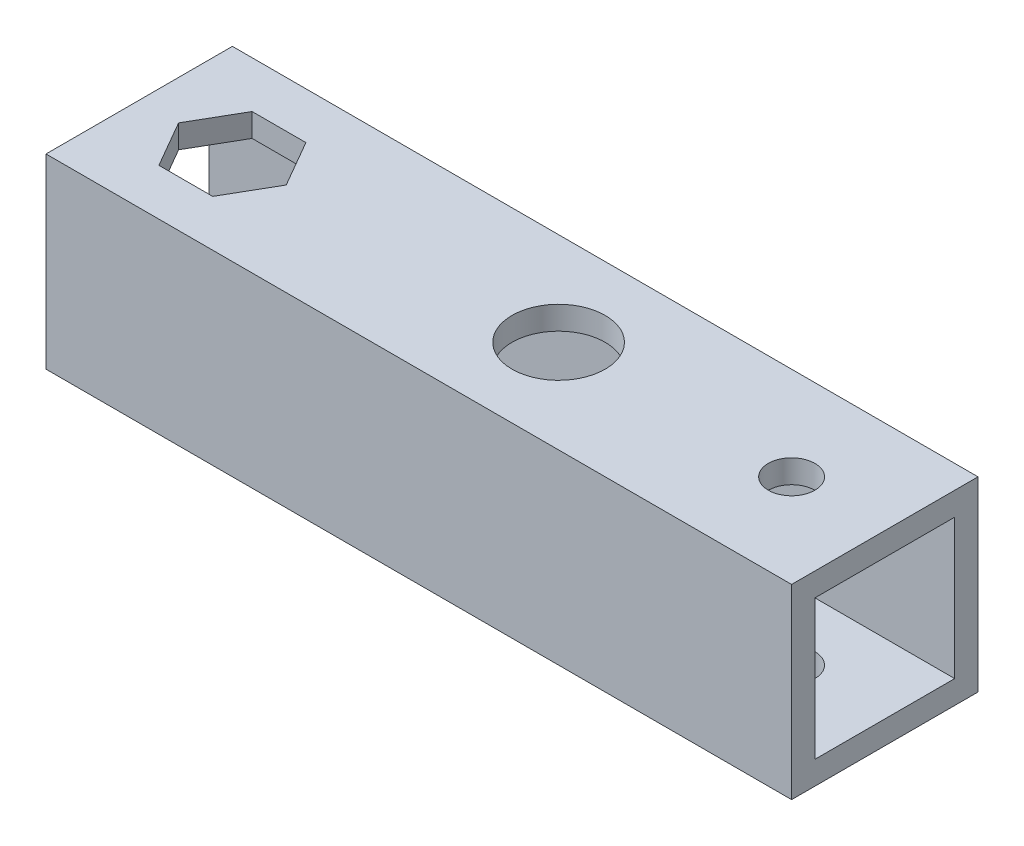
ISO-10303-21;
HEADER;
FILE_DESCRIPTION(('STEP AP214'),'2;1');
FILE_NAME('part.step','',(''),(''),'','','');
FILE_SCHEMA(('AUTOMOTIVE_DESIGN { 1 0 10303 214 1 1 1 1 }'));
ENDSEC;
DATA;
#1=APPLICATION_CONTEXT('core data for automotive mechanical design processes');
#2=APPLICATION_PROTOCOL_DEFINITION('international standard','automotive_design',2000,#1);
#3=PRODUCT_CONTEXT('',#1,'mechanical');
#4=PRODUCT('Part','Part','',(#3));
#5=PRODUCT_RELATED_PRODUCT_CATEGORY('part','',(#4));
#6=PRODUCT_DEFINITION_FORMATION('','',#4);
#7=PRODUCT_DEFINITION_CONTEXT('part definition',#1,'design');
#8=PRODUCT_DEFINITION('design','',#6,#7);
#9=PRODUCT_DEFINITION_SHAPE('','',#8);
#10=(LENGTH_UNIT() NAMED_UNIT(*) SI_UNIT(.MILLI.,.METRE.));
#11=(NAMED_UNIT(*) PLANE_ANGLE_UNIT() SI_UNIT($,.RADIAN.));
#12=(NAMED_UNIT(*) SI_UNIT($,.STERADIAN.) SOLID_ANGLE_UNIT());
#13=UNCERTAINTY_MEASURE_WITH_UNIT(LENGTH_MEASURE(1.E-05),#10,'distance_accuracy_value','');
#14=(GEOMETRIC_REPRESENTATION_CONTEXT(3) GLOBAL_UNCERTAINTY_ASSIGNED_CONTEXT((#13)) GLOBAL_UNIT_ASSIGNED_CONTEXT((#10,
#11,#12)) REPRESENTATION_CONTEXT('',''));
#15=CARTESIAN_POINT('',(0.,0.,0.));
#16=DIRECTION('',(0.,0.,1.));
#17=DIRECTION('',(1.,0.,0.));
#18=AXIS2_PLACEMENT_3D('',#15,#16,#17);
#19=CARTESIAN_POINT('',(44.45,25.4,0.));
#20=DIRECTION('',(0.,-1.,0.));
#21=DIRECTION('',(0.,0.,-1.));
#22=AXIS2_PLACEMENT_3D('',#19,#20,#21);
#23=CYLINDRICAL_SURFACE('',#22,6.35);
#24=CARTESIAN_POINT('',(44.45,22.225,0.));
#25=DIRECTION('',(0.,1.,0.));
#26=DIRECTION('',(0.,0.,1.));
#27=AXIS2_PLACEMENT_3D('',#24,#25,#26);
#28=CIRCLE('',#27,6.35);
#29=CARTESIAN_POINT('',(44.45,22.225,6.35));
#30=VERTEX_POINT('',#29);
#31=EDGE_CURVE('E234',#30,#30,#28,.T.);
#32=ORIENTED_EDGE('',*,*,#31,.F.);
#33=EDGE_LOOP('',(#32));
#34=FACE_BOUND('',#33,.T.);
#35=CARTESIAN_POINT('',(44.45,25.4,0.));
#36=DIRECTION('',(0.,1.,0.));
#37=DIRECTION('',(0.,0.,1.));
#38=AXIS2_PLACEMENT_3D('',#35,#36,#37);
#39=CIRCLE('',#38,6.35);
#40=CARTESIAN_POINT('',(44.45,25.4,6.35));
#41=VERTEX_POINT('',#40);
#42=EDGE_CURVE('E299',#41,#41,#39,.T.);
#43=ORIENTED_EDGE('',*,*,#42,.T.);
#44=EDGE_LOOP('',(#43));
#45=FACE_BOUND('',#44,.T.);
#46=ADVANCED_FACE('F33',(#34,#45),#23,.F.);
#47=CARTESIAN_POINT('',(76.2,25.4,0.));
#48=DIRECTION('',(0.,-1.,0.));
#49=DIRECTION('',(0.,0.,-1.));
#50=AXIS2_PLACEMENT_3D('',#47,#48,#49);
#51=CYLINDRICAL_SURFACE('',#50,3.175);
#52=CARTESIAN_POINT('',(76.2,22.225,0.));
#53=DIRECTION('',(0.,1.,0.));
#54=DIRECTION('',(0.,0.,1.));
#55=AXIS2_PLACEMENT_3D('',#52,#53,#54);
#56=CIRCLE('',#55,3.175);
#57=CARTESIAN_POINT('',(76.2,22.225,3.175));
#58=VERTEX_POINT('',#57);
#59=EDGE_CURVE('E231',#58,#58,#56,.T.);
#60=ORIENTED_EDGE('',*,*,#59,.F.);
#61=EDGE_LOOP('',(#60));
#62=FACE_BOUND('',#61,.T.);
#63=CARTESIAN_POINT('',(76.2,25.4,0.));
#64=DIRECTION('',(0.,1.,0.));
#65=DIRECTION('',(0.,0.,1.));
#66=AXIS2_PLACEMENT_3D('',#63,#64,#65);
#67=CIRCLE('',#66,3.175);
#68=CARTESIAN_POINT('',(76.2,25.4,3.175));
#69=VERTEX_POINT('',#68);
#70=EDGE_CURVE('E293',#69,#69,#67,.T.);
#71=ORIENTED_EDGE('',*,*,#70,.T.);
#72=EDGE_LOOP('',(#71));
#73=FACE_BOUND('',#72,.T.);
#74=ADVANCED_FACE('F379',(#62,#73),#51,.F.);
#75=CARTESIAN_POINT('',(3.66617420935413,25.4,6.35));
#76=DIRECTION('',(-0.866025403784439,0.,-0.5));
#77=DIRECTION('',(-0.5,0.,0.866025403784439));
#78=AXIS2_PLACEMENT_3D('',#75,#76,#77);
#79=PLANE('',#78);
#80=DIRECTION('',(0.5,0.,-0.866025403784439));
#81=VECTOR('',#80,1.);
#82=CARTESIAN_POINT('',(3.66617420935413,22.225,6.35));
#83=LINE('',#82,#81);
#84=CARTESIAN_POINT('',(3.66617420935413,22.225,6.35));
#85=VERTEX_POINT('',#84);
#86=CARTESIAN_POINT('',(7.33234841870825,22.225,0.));
#87=VERTEX_POINT('',#86);
#88=EDGE_CURVE('E229',#85,#87,#83,.T.);
#89=ORIENTED_EDGE('',*,*,#88,.F.);
#90=DIRECTION('',(0.,-1.,0.));
#91=VECTOR('',#90,1.);
#92=CARTESIAN_POINT('',(3.66617420935413,25.4,6.35));
#93=LINE('',#92,#91);
#94=CARTESIAN_POINT('',(3.66617420935413,25.4,6.35));
#95=VERTEX_POINT('',#94);
#96=EDGE_CURVE('E269',#95,#85,#93,.T.);
#97=ORIENTED_EDGE('',*,*,#96,.F.);
#98=DIRECTION('',(0.5,0.,-0.866025403784439));
#99=VECTOR('',#98,1.);
#100=CARTESIAN_POINT('',(3.66617420935413,25.4,6.35));
#101=LINE('',#100,#99);
#102=CARTESIAN_POINT('',(7.33234841870825,25.4,0.));
#103=VERTEX_POINT('',#102);
#104=EDGE_CURVE('E238',#95,#103,#101,.T.);
#105=ORIENTED_EDGE('',*,*,#104,.T.);
#106=DIRECTION('',(0.,-1.,0.));
#107=VECTOR('',#106,1.);
#108=CARTESIAN_POINT('',(7.33234841870825,25.4,0.));
#109=LINE('',#108,#107);
#110=EDGE_CURVE('E289',#103,#87,#109,.T.);
#111=ORIENTED_EDGE('',*,*,#110,.T.);
#112=EDGE_LOOP('',(#89,#97,#105,#111));
#113=FACE_BOUND('',#112,.T.);
#114=ADVANCED_FACE('F369',(#113),#79,.T.);
#115=CARTESIAN_POINT('',(7.33234841870825,25.4,0.));
#116=DIRECTION('',(-0.866025403784438,0.,0.5));
#117=DIRECTION('',(0.5,0.,0.866025403784439));
#118=AXIS2_PLACEMENT_3D('',#115,#116,#117);
#119=PLANE('',#118);
#120=DIRECTION('',(-0.5,0.,-0.866025403784439));
#121=VECTOR('',#120,1.);
#122=CARTESIAN_POINT('',(7.33234841870825,22.225,0.));
#123=LINE('',#122,#121);
#124=CARTESIAN_POINT('',(3.66617420935412,22.225,-6.35));
#125=VERTEX_POINT('',#124);
#126=EDGE_CURVE('E227',#87,#125,#123,.T.);
#127=ORIENTED_EDGE('',*,*,#126,.F.);
#128=ORIENTED_EDGE('',*,*,#110,.F.);
#129=DIRECTION('',(-0.5,0.,-0.866025403784438));
#130=VECTOR('',#129,1.);
#131=CARTESIAN_POINT('',(7.33234841870825,25.4,0.));
#132=LINE('',#131,#130);
#133=CARTESIAN_POINT('',(3.66617420935412,25.4,-6.35));
#134=VERTEX_POINT('',#133);
#135=EDGE_CURVE('E240',#103,#134,#132,.T.);
#136=ORIENTED_EDGE('',*,*,#135,.T.);
#137=DIRECTION('',(0.,-1.,0.));
#138=VECTOR('',#137,1.);
#139=CARTESIAN_POINT('',(3.66617420935412,25.4,-6.35));
#140=LINE('',#139,#138);
#141=EDGE_CURVE('E285',#134,#125,#140,.T.);
#142=ORIENTED_EDGE('',*,*,#141,.T.);
#143=EDGE_LOOP('',(#127,#128,#136,#142));
#144=FACE_BOUND('',#143,.T.);
#145=ADVANCED_FACE('F375',(#144),#119,.T.);
#146=CARTESIAN_POINT('',(3.66617420935412,25.4,-6.35));
#147=DIRECTION('',(0.,0.,1.));
#148=DIRECTION('',(1.,0.,0.));
#149=AXIS2_PLACEMENT_3D('',#146,#147,#148);
#150=PLANE('',#149);
#151=DIRECTION('',(-1.,0.,0.));
#152=VECTOR('',#151,1.);
#153=CARTESIAN_POINT('',(3.66617420935412,22.225,-6.35));
#154=LINE('',#153,#152);
#155=CARTESIAN_POINT('',(-3.66617420935412,22.225,-6.35));
#156=VERTEX_POINT('',#155);
#157=EDGE_CURVE('E225',#125,#156,#154,.T.);
#158=ORIENTED_EDGE('',*,*,#157,.F.);
#159=ORIENTED_EDGE('',*,*,#141,.F.);
#160=DIRECTION('',(-1.,0.,0.));
#161=VECTOR('',#160,1.);
#162=CARTESIAN_POINT('',(3.66617420935412,25.4,-6.35));
#163=LINE('',#162,#161);
#164=CARTESIAN_POINT('',(-3.66617420935412,25.4,-6.35));
#165=VERTEX_POINT('',#164);
#166=EDGE_CURVE('E243',#134,#165,#163,.T.);
#167=ORIENTED_EDGE('',*,*,#166,.T.);
#168=DIRECTION('',(0.,-1.,0.));
#169=VECTOR('',#168,1.);
#170=CARTESIAN_POINT('',(-3.66617420935412,25.4,-6.35));
#171=LINE('',#170,#169);
#172=EDGE_CURVE('E281',#165,#156,#171,.T.);
#173=ORIENTED_EDGE('',*,*,#172,.T.);
#174=EDGE_LOOP('',(#158,#159,#167,#173));
#175=FACE_BOUND('',#174,.T.);
#176=ADVANCED_FACE('F455',(#175),#150,.T.);
#177=CARTESIAN_POINT('',(-3.66617420935412,25.4,-6.35));
#178=DIRECTION('',(0.866025403784439,0.,0.5));
#179=DIRECTION('',(0.5,0.,-0.866025403784439));
#180=AXIS2_PLACEMENT_3D('',#177,#178,#179);
#181=PLANE('',#180);
#182=DIRECTION('',(-0.5,0.,0.866025403784439));
#183=VECTOR('',#182,1.);
#184=CARTESIAN_POINT('',(-3.66617420935412,22.225,-6.35));
#185=LINE('',#184,#183);
#186=CARTESIAN_POINT('',(-7.33234841870825,22.225,0.));
#187=VERTEX_POINT('',#186);
#188=EDGE_CURVE('E223',#156,#187,#185,.T.);
#189=ORIENTED_EDGE('',*,*,#188,.F.);
#190=ORIENTED_EDGE('',*,*,#172,.F.);
#191=DIRECTION('',(-0.5,0.,0.866025403784439));
#192=VECTOR('',#191,1.);
#193=CARTESIAN_POINT('',(-3.66617420935412,25.4,-6.35));
#194=LINE('',#193,#192);
#195=CARTESIAN_POINT('',(-7.33234841870825,25.4,0.));
#196=VERTEX_POINT('',#195);
#197=EDGE_CURVE('E245',#165,#196,#194,.T.);
#198=ORIENTED_EDGE('',*,*,#197,.T.);
#199=DIRECTION('',(0.,-1.,0.));
#200=VECTOR('',#199,1.);
#201=CARTESIAN_POINT('',(-7.33234841870825,25.4,0.));
#202=LINE('',#201,#200);
#203=EDGE_CURVE('E277',#196,#187,#202,.T.);
#204=ORIENTED_EDGE('',*,*,#203,.T.);
#205=EDGE_LOOP('',(#189,#190,#198,#204));
#206=FACE_BOUND('',#205,.T.);
#207=ADVANCED_FACE('F459',(#206),#181,.T.);
#208=CARTESIAN_POINT('',(-7.33234841870825,25.4,0.));
#209=DIRECTION('',(0.866025403784438,0.,-0.5));
#210=DIRECTION('',(-0.5,0.,-0.866025403784439));
#211=AXIS2_PLACEMENT_3D('',#208,#209,#210);
#212=PLANE('',#211);
#213=DIRECTION('',(0.5,0.,0.866025403784439));
#214=VECTOR('',#213,1.);
#215=CARTESIAN_POINT('',(-7.33234841870825,22.225,0.));
#216=LINE('',#215,#214);
#217=CARTESIAN_POINT('',(-3.66617420935412,22.225,6.35));
#218=VERTEX_POINT('',#217);
#219=EDGE_CURVE('E221',#187,#218,#216,.T.);
#220=ORIENTED_EDGE('',*,*,#219,.F.);
#221=ORIENTED_EDGE('',*,*,#203,.F.);
#222=DIRECTION('',(0.5,0.,0.866025403784438));
#223=VECTOR('',#222,1.);
#224=CARTESIAN_POINT('',(-7.33234841870825,25.4,0.));
#225=LINE('',#224,#223);
#226=CARTESIAN_POINT('',(-3.66617420935412,25.4,6.35));
#227=VERTEX_POINT('',#226);
#228=EDGE_CURVE('E247',#196,#227,#225,.T.);
#229=ORIENTED_EDGE('',*,*,#228,.T.);
#230=DIRECTION('',(0.,-1.,0.));
#231=VECTOR('',#230,1.);
#232=CARTESIAN_POINT('',(-3.66617420935412,25.4,6.35));
#233=LINE('',#232,#231);
#234=EDGE_CURVE('E273',#227,#218,#233,.T.);
#235=ORIENTED_EDGE('',*,*,#234,.T.);
#236=EDGE_LOOP('',(#220,#221,#229,#235));
#237=FACE_BOUND('',#236,.T.);
#238=ADVANCED_FACE('F463',(#237),#212,.T.);
#239=CARTESIAN_POINT('',(-3.66617420935412,25.4,6.35));
#240=DIRECTION('',(0.,0.,-1.));
#241=DIRECTION('',(-1.,0.,0.));
#242=AXIS2_PLACEMENT_3D('',#239,#240,#241);
#243=PLANE('',#242);
#244=DIRECTION('',(1.,0.,0.));
#245=VECTOR('',#244,1.);
#246=CARTESIAN_POINT('',(-3.66617420935412,22.225,6.35));
#247=LINE('',#246,#245);
#248=EDGE_CURVE('E11',#218,#85,#247,.T.);
#249=ORIENTED_EDGE('',*,*,#248,.F.);
#250=ORIENTED_EDGE('',*,*,#234,.F.);
#251=DIRECTION('',(1.,0.,0.));
#252=VECTOR('',#251,1.);
#253=CARTESIAN_POINT('',(-3.66617420935412,25.4,6.35));
#254=LINE('',#253,#252);
#255=EDGE_CURVE('E250',#227,#95,#254,.T.);
#256=ORIENTED_EDGE('',*,*,#255,.T.);
#257=ORIENTED_EDGE('',*,*,#96,.T.);
#258=EDGE_LOOP('',(#249,#250,#256,#257));
#259=FACE_BOUND('',#258,.T.);
#260=ADVANCED_FACE('F414',(#259),#243,.T.);
#261=CARTESIAN_POINT('',(0.,25.4,0.));
#262=DIRECTION('',(0.,-1.,0.));
#263=DIRECTION('',(0.,0.,-1.));
#264=AXIS2_PLACEMENT_3D('',#261,#262,#263);
#265=PLANE('',#264);
#266=ORIENTED_EDGE('',*,*,#70,.F.);
#267=EDGE_LOOP('',(#266));
#268=FACE_BOUND('',#267,.T.);
#269=DIRECTION('',(0.,0.,-1.));
#270=VECTOR('',#269,1.);
#271=CARTESIAN_POINT('',(88.8999999999999,25.4,-12.7));
#272=LINE('',#271,#270);
#273=CARTESIAN_POINT('',(88.8999999999999,25.4,12.7));
#274=VERTEX_POINT('',#273);
#275=CARTESIAN_POINT('',(88.8999999999999,25.4,-12.7));
#276=VERTEX_POINT('',#275);
#277=EDGE_CURVE('E305',#274,#276,#272,.T.);
#278=ORIENTED_EDGE('',*,*,#277,.T.);
#279=DIRECTION('',(-1.,0.,0.));
#280=VECTOR('',#279,1.);
#281=CARTESIAN_POINT('',(88.8999999999999,25.4,-12.7));
#282=LINE('',#281,#280);
#283=CARTESIAN_POINT('',(-12.7,25.4,-12.7));
#284=VERTEX_POINT('',#283);
#285=EDGE_CURVE('E308',#276,#284,#282,.T.);
#286=ORIENTED_EDGE('',*,*,#285,.T.);
#287=DIRECTION('',(0.,0.,1.));
#288=VECTOR('',#287,1.);
#289=CARTESIAN_POINT('',(-12.7,25.4,-12.7));
#290=LINE('',#289,#288);
#291=CARTESIAN_POINT('',(-12.7,25.4,12.7));
#292=VERTEX_POINT('',#291);
#293=EDGE_CURVE('E311',#284,#292,#290,.T.);
#294=ORIENTED_EDGE('',*,*,#293,.T.);
#295=DIRECTION('',(1.,0.,0.));
#296=VECTOR('',#295,1.);
#297=CARTESIAN_POINT('',(88.8999999999999,25.4,12.7));
#298=LINE('',#297,#296);
#299=EDGE_CURVE('E313',#292,#274,#298,.T.);
#300=ORIENTED_EDGE('',*,*,#299,.T.);
#301=EDGE_LOOP('',(#278,#286,#294,#300));
#302=FACE_BOUND('',#301,.T.);
#303=ORIENTED_EDGE('',*,*,#42,.F.);
#304=EDGE_LOOP('',(#303));
#305=FACE_BOUND('',#304,.T.);
#306=ORIENTED_EDGE('',*,*,#104,.F.);
#307=ORIENTED_EDGE('',*,*,#255,.F.);
#308=ORIENTED_EDGE('',*,*,#228,.F.);
#309=ORIENTED_EDGE('',*,*,#197,.F.);
#310=ORIENTED_EDGE('',*,*,#166,.F.);
#311=ORIENTED_EDGE('',*,*,#135,.F.);
#312=EDGE_LOOP('',(#306,#307,#308,#309,#310,#311));
#313=FACE_BOUND('',#312,.T.);
#314=ADVANCED_FACE('F405',(#268,#302,#305,#313),#265,.F.);
#315=CARTESIAN_POINT('',(0.,0.,0.));
#316=DIRECTION('',(0.,-1.,0.));
#317=DIRECTION('',(0.,0.,-1.));
#318=AXIS2_PLACEMENT_3D('',#315,#316,#317);
#319=PLANE('',#318);
#320=CARTESIAN_POINT('',(76.2,0.,0.));
#321=DIRECTION('',(0.,1.,0.));
#322=DIRECTION('',(0.,0.,1.));
#323=AXIS2_PLACEMENT_3D('',#320,#321,#322);
#324=CIRCLE('',#323,3.175);
#325=CARTESIAN_POINT('',(76.2,0.,3.175));
#326=VERTEX_POINT('',#325);
#327=EDGE_CURVE('E292',#326,#326,#324,.T.);
#328=ORIENTED_EDGE('',*,*,#327,.T.);
#329=EDGE_LOOP('',(#328));
#330=FACE_BOUND('',#329,.T.);
#331=DIRECTION('',(0.,0.,-1.));
#332=VECTOR('',#331,1.);
#333=CARTESIAN_POINT('',(88.8999999999999,0.,-12.7));
#334=LINE('',#333,#332);
#335=CARTESIAN_POINT('',(88.8999999999999,0.,12.7));
#336=VERTEX_POINT('',#335);
#337=CARTESIAN_POINT('',(88.8999999999999,0.,-12.7));
#338=VERTEX_POINT('',#337);
#339=EDGE_CURVE('E302',#336,#338,#334,.T.);
#340=ORIENTED_EDGE('',*,*,#339,.F.);
#341=DIRECTION('',(1.,0.,0.));
#342=VECTOR('',#341,1.);
#343=CARTESIAN_POINT('',(88.8999999999999,0.,12.7));
#344=LINE('',#343,#342);
#345=CARTESIAN_POINT('',(-12.7,0.,12.7));
#346=VERTEX_POINT('',#345);
#347=EDGE_CURVE('E309',#346,#336,#344,.T.);
#348=ORIENTED_EDGE('',*,*,#347,.F.);
#349=DIRECTION('',(0.,0.,1.));
#350=VECTOR('',#349,1.);
#351=CARTESIAN_POINT('',(-12.7,0.,-12.7));
#352=LINE('',#351,#350);
#353=CARTESIAN_POINT('',(-12.7,0.,-12.7));
#354=VERTEX_POINT('',#353);
#355=EDGE_CURVE('E320',#354,#346,#352,.T.);
#356=ORIENTED_EDGE('',*,*,#355,.F.);
#357=DIRECTION('',(-1.,0.,0.));
#358=VECTOR('',#357,1.);
#359=CARTESIAN_POINT('',(88.8999999999999,0.,-12.7));
#360=LINE('',#359,#358);
#361=EDGE_CURVE('E318',#338,#354,#360,.T.);
#362=ORIENTED_EDGE('',*,*,#361,.F.);
#363=EDGE_LOOP('',(#340,#348,#356,#362));
#364=FACE_BOUND('',#363,.T.);
#365=CARTESIAN_POINT('',(44.45,0.,0.));
#366=DIRECTION('',(0.,1.,0.));
#367=DIRECTION('',(0.,0.,1.));
#368=AXIS2_PLACEMENT_3D('',#365,#366,#367);
#369=CIRCLE('',#368,6.35);
#370=CARTESIAN_POINT('',(44.45,0.,6.35));
#371=VERTEX_POINT('',#370);
#372=EDGE_CURVE('E296',#371,#371,#369,.T.);
#373=ORIENTED_EDGE('',*,*,#372,.T.);
#374=EDGE_LOOP('',(#373));
#375=FACE_BOUND('',#374,.T.);
#376=DIRECTION('',(1.,0.,0.));
#377=VECTOR('',#376,1.);
#378=CARTESIAN_POINT('',(-3.66617420935412,0.,6.35));
#379=LINE('',#378,#377);
#380=CARTESIAN_POINT('',(-3.66617420935412,0.,6.35));
#381=VERTEX_POINT('',#380);
#382=CARTESIAN_POINT('',(3.66617420935413,0.,6.35));
#383=VERTEX_POINT('',#382);
#384=EDGE_CURVE('E241',#381,#383,#379,.T.);
#385=ORIENTED_EDGE('',*,*,#384,.T.);
#386=DIRECTION('',(0.5,0.,-0.866025403784439));
#387=VECTOR('',#386,1.);
#388=CARTESIAN_POINT('',(3.66617420935413,0.,6.35));
#389=LINE('',#388,#387);
#390=CARTESIAN_POINT('',(7.33234841870825,0.,0.));
#391=VERTEX_POINT('',#390);
#392=EDGE_CURVE('E237',#383,#391,#389,.T.);
#393=ORIENTED_EDGE('',*,*,#392,.T.);
#394=DIRECTION('',(-0.5,0.,-0.866025403784438));
#395=VECTOR('',#394,1.);
#396=CARTESIAN_POINT('',(7.33234841870825,0.,0.));
#397=LINE('',#396,#395);
#398=CARTESIAN_POINT('',(3.66617420935412,0.,-6.35));
#399=VERTEX_POINT('',#398);
#400=EDGE_CURVE('E255',#391,#399,#397,.T.);
#401=ORIENTED_EDGE('',*,*,#400,.T.);
#402=DIRECTION('',(-1.,0.,0.));
#403=VECTOR('',#402,1.);
#404=CARTESIAN_POINT('',(3.66617420935412,0.,-6.35));
#405=LINE('',#404,#403);
#406=CARTESIAN_POINT('',(-3.66617420935412,0.,-6.35));
#407=VERTEX_POINT('',#406);
#408=EDGE_CURVE('E258',#399,#407,#405,.T.);
#409=ORIENTED_EDGE('',*,*,#408,.T.);
#410=DIRECTION('',(-0.5,0.,0.866025403784439));
#411=VECTOR('',#410,1.);
#412=CARTESIAN_POINT('',(-3.66617420935412,0.,-6.35));
#413=LINE('',#412,#411);
#414=CARTESIAN_POINT('',(-7.33234841870825,0.,0.));
#415=VERTEX_POINT('',#414);
#416=EDGE_CURVE('E261',#407,#415,#413,.T.);
#417=ORIENTED_EDGE('',*,*,#416,.T.);
#418=DIRECTION('',(0.5,0.,0.866025403784438));
#419=VECTOR('',#418,1.);
#420=CARTESIAN_POINT('',(-7.33234841870825,0.,0.));
#421=LINE('',#420,#419);
#422=EDGE_CURVE('E264',#415,#381,#421,.T.);
#423=ORIENTED_EDGE('',*,*,#422,.T.);
#424=EDGE_LOOP('',(#385,#393,#401,#409,#417,#423));
#425=FACE_BOUND('',#424,.T.);
#426=ADVANCED_FACE('F349',(#330,#364,#375,#425),#319,.T.);
#427=CARTESIAN_POINT('',(88.8999999999999,25.4,-12.7));
#428=DIRECTION('',(-1.,0.,0.));
#429=DIRECTION('',(0.,0.,1.));
#430=AXIS2_PLACEMENT_3D('',#427,#428,#429);
#431=PLANE('',#430);
#432=DIRECTION('',(0.,0.,-1.));
#433=VECTOR('',#432,1.);
#434=CARTESIAN_POINT('',(88.8999999999999,3.175,9.52499999999999));
#435=LINE('',#434,#433);
#436=CARTESIAN_POINT('',(88.8999999999999,3.175,9.52499999999999));
#437=VERTEX_POINT('',#436);
#438=CARTESIAN_POINT('',(88.8999999999999,3.175,-9.52500000000001));
#439=VERTEX_POINT('',#438);
#440=EDGE_CURVE('E196',#437,#439,#435,.T.);
#441=ORIENTED_EDGE('',*,*,#440,.F.);
#442=DIRECTION('',(0.,-1.,0.));
#443=VECTOR('',#442,1.);
#444=CARTESIAN_POINT('',(88.8999999999999,22.225,9.52499999999999));
#445=LINE('',#444,#443);
#446=CARTESIAN_POINT('',(88.8999999999999,22.225,9.52499999999999));
#447=VERTEX_POINT('',#446);
#448=EDGE_CURVE('E48',#447,#437,#445,.T.);
#449=ORIENTED_EDGE('',*,*,#448,.F.);
#450=DIRECTION('',(0.,0.,1.));
#451=VECTOR('',#450,1.);
#452=CARTESIAN_POINT('',(88.8999999999999,22.225,-9.52500000000001));
#453=LINE('',#452,#451);
#454=CARTESIAN_POINT('',(88.8999999999999,22.225,-9.52500000000001));
#455=VERTEX_POINT('',#454);
#456=EDGE_CURVE('E187',#455,#447,#453,.T.);
#457=ORIENTED_EDGE('',*,*,#456,.F.);
#458=DIRECTION('',(0.,1.,0.));
#459=VECTOR('',#458,1.);
#460=CARTESIAN_POINT('',(88.8999999999999,3.175,-9.52500000000001));
#461=LINE('',#460,#459);
#462=EDGE_CURVE('E190',#439,#455,#461,.T.);
#463=ORIENTED_EDGE('',*,*,#462,.F.);
#464=EDGE_LOOP('',(#441,#449,#457,#463));
#465=FACE_BOUND('',#464,.T.);
#466=ORIENTED_EDGE('',*,*,#339,.T.);
#467=DIRECTION('',(0.,-1.,0.));
#468=VECTOR('',#467,1.);
#469=CARTESIAN_POINT('',(88.8999999999999,25.4,-12.7));
#470=LINE('',#469,#468);
#471=EDGE_CURVE('E331',#276,#338,#470,.T.);
#472=ORIENTED_EDGE('',*,*,#471,.F.);
#473=ORIENTED_EDGE('',*,*,#277,.F.);
#474=DIRECTION('',(0.,-1.,0.));
#475=VECTOR('',#474,1.);
#476=CARTESIAN_POINT('',(88.8999999999999,25.4,12.7));
#477=LINE('',#476,#475);
#478=EDGE_CURVE('E315',#274,#336,#477,.T.);
#479=ORIENTED_EDGE('',*,*,#478,.T.);
#480=EDGE_LOOP('',(#466,#472,#473,#479));
#481=FACE_BOUND('',#480,.T.);
#482=ADVANCED_FACE('F35',(#465,#481),#431,.F.);
#483=CARTESIAN_POINT('',(88.8999999999999,25.4,-12.7));
#484=DIRECTION('',(0.,0.,1.));
#485=DIRECTION('',(1.,0.,0.));
#486=AXIS2_PLACEMENT_3D('',#483,#484,#485);
#487=PLANE('',#486);
#488=ORIENTED_EDGE('',*,*,#361,.T.);
#489=DIRECTION('',(0.,-1.,0.));
#490=VECTOR('',#489,1.);
#491=CARTESIAN_POINT('',(-12.7,25.4,-12.7));
#492=LINE('',#491,#490);
#493=EDGE_CURVE('E328',#284,#354,#492,.T.);
#494=ORIENTED_EDGE('',*,*,#493,.F.);
#495=ORIENTED_EDGE('',*,*,#285,.F.);
#496=ORIENTED_EDGE('',*,*,#471,.T.);
#497=EDGE_LOOP('',(#488,#494,#495,#496));
#498=FACE_BOUND('',#497,.T.);
#499=ADVANCED_FACE('F412',(#498),#487,.F.);
#500=CARTESIAN_POINT('',(-12.7,25.4,-12.7));
#501=DIRECTION('',(1.,0.,0.));
#502=DIRECTION('',(0.,0.,-1.));
#503=AXIS2_PLACEMENT_3D('',#500,#501,#502);
#504=PLANE('',#503);
#505=DIRECTION('',(0.,0.,1.));
#506=VECTOR('',#505,1.);
#507=CARTESIAN_POINT('',(-12.7,22.225,-9.52500000000001));
#508=LINE('',#507,#506);
#509=CARTESIAN_POINT('',(-12.7,22.225,-9.52500000000001));
#510=VERTEX_POINT('',#509);
#511=CARTESIAN_POINT('',(-12.7,22.225,9.52499999999999));
#512=VERTEX_POINT('',#511);
#513=EDGE_CURVE('E177',#510,#512,#508,.T.);
#514=ORIENTED_EDGE('',*,*,#513,.T.);
#515=DIRECTION('',(0.,-1.,0.));
#516=VECTOR('',#515,1.);
#517=CARTESIAN_POINT('',(-12.7,22.225,9.52499999999999));
#518=LINE('',#517,#516);
#519=CARTESIAN_POINT('',(-12.7,3.175,9.52499999999999));
#520=VERTEX_POINT('',#519);
#521=EDGE_CURVE('E171',#512,#520,#518,.T.);
#522=ORIENTED_EDGE('',*,*,#521,.T.);
#523=DIRECTION('',(0.,0.,-1.));
#524=VECTOR('',#523,1.);
#525=CARTESIAN_POINT('',(-12.7,3.175,9.52499999999999));
#526=LINE('',#525,#524);
#527=CARTESIAN_POINT('',(-12.7,3.175,-9.52500000000001));
#528=VERTEX_POINT('',#527);
#529=EDGE_CURVE('E180',#520,#528,#526,.T.);
#530=ORIENTED_EDGE('',*,*,#529,.T.);
#531=DIRECTION('',(0.,1.,0.));
#532=VECTOR('',#531,1.);
#533=CARTESIAN_POINT('',(-12.7,3.175,-9.52500000000001));
#534=LINE('',#533,#532);
#535=EDGE_CURVE('E56',#528,#510,#534,.T.);
#536=ORIENTED_EDGE('',*,*,#535,.T.);
#537=EDGE_LOOP('',(#514,#522,#530,#536));
#538=FACE_BOUND('',#537,.T.);
#539=ORIENTED_EDGE('',*,*,#355,.T.);
#540=DIRECTION('',(0.,-1.,0.));
#541=VECTOR('',#540,1.);
#542=CARTESIAN_POINT('',(-12.7,25.4,12.7));
#543=LINE('',#542,#541);
#544=EDGE_CURVE('E325',#292,#346,#543,.T.);
#545=ORIENTED_EDGE('',*,*,#544,.F.);
#546=ORIENTED_EDGE('',*,*,#293,.F.);
#547=ORIENTED_EDGE('',*,*,#493,.T.);
#548=EDGE_LOOP('',(#539,#545,#546,#547));
#549=FACE_BOUND('',#548,.T.);
#550=ADVANCED_FACE('F184',(#538,#549),#504,.F.);
#551=CARTESIAN_POINT('',(88.8999999999999,25.4,12.7));
#552=DIRECTION('',(0.,0.,-1.));
#553=DIRECTION('',(-1.,0.,0.));
#554=AXIS2_PLACEMENT_3D('',#551,#552,#553);
#555=PLANE('',#554);
#556=ORIENTED_EDGE('',*,*,#347,.T.);
#557=ORIENTED_EDGE('',*,*,#478,.F.);
#558=ORIENTED_EDGE('',*,*,#299,.F.);
#559=ORIENTED_EDGE('',*,*,#544,.T.);
#560=EDGE_LOOP('',(#556,#557,#558,#559));
#561=FACE_BOUND('',#560,.T.);
#562=ADVANCED_FACE('F393',(#561),#555,.F.);
#563=CARTESIAN_POINT('',(44.45,3.175,0.));
#564=DIRECTION('',(0.,-1.,0.));
#565=DIRECTION('',(0.,0.,-1.));
#566=AXIS2_PLACEMENT_3D('',#563,#564,#565);
#567=CIRCLE('',#566,6.35);
#568=CARTESIAN_POINT('',(44.45,3.175,-6.35));
#569=VERTEX_POINT('',#568);
#570=EDGE_CURVE('E218',#569,#569,#567,.T.);
#571=ORIENTED_EDGE('',*,*,#570,.F.);
#572=EDGE_LOOP('',(#571));
#573=FACE_BOUND('',#572,.T.);
#574=ORIENTED_EDGE('',*,*,#372,.F.);
#575=EDGE_LOOP('',(#574));
#576=FACE_BOUND('',#575,.T.);
#577=ADVANCED_FACE('F376',(#573,#576),#23,.F.);
#578=CARTESIAN_POINT('',(76.2,3.175,0.));
#579=DIRECTION('',(0.,-1.,0.));
#580=DIRECTION('',(0.,0.,-1.));
#581=AXIS2_PLACEMENT_3D('',#578,#579,#580);
#582=CIRCLE('',#581,3.175);
#583=CARTESIAN_POINT('',(76.2,3.175,-3.175));
#584=VERTEX_POINT('',#583);
#585=EDGE_CURVE('E215',#584,#584,#582,.T.);
#586=ORIENTED_EDGE('',*,*,#585,.F.);
#587=EDGE_LOOP('',(#586));
#588=FACE_BOUND('',#587,.T.);
#589=ORIENTED_EDGE('',*,*,#327,.F.);
#590=EDGE_LOOP('',(#589));
#591=FACE_BOUND('',#590,.T.);
#592=ADVANCED_FACE('F367',(#588,#591),#51,.F.);
#593=DIRECTION('',(-0.5,0.,0.866025403784439));
#594=VECTOR('',#593,1.);
#595=CARTESIAN_POINT('',(3.66617420935413,3.175,6.35));
#596=LINE('',#595,#594);
#597=CARTESIAN_POINT('',(7.33234841870825,3.175,0.));
#598=VERTEX_POINT('',#597);
#599=CARTESIAN_POINT('',(3.66617420935413,3.175,6.35));
#600=VERTEX_POINT('',#599);
#601=EDGE_CURVE('E213',#598,#600,#596,.T.);
#602=ORIENTED_EDGE('',*,*,#601,.F.);
#603=EDGE_CURVE('E288',#598,#391,#109,.T.);
#604=ORIENTED_EDGE('',*,*,#603,.T.);
#605=ORIENTED_EDGE('',*,*,#392,.F.);
#606=EDGE_CURVE('E252',#600,#383,#93,.T.);
#607=ORIENTED_EDGE('',*,*,#606,.F.);
#608=EDGE_LOOP('',(#602,#604,#605,#607));
#609=FACE_BOUND('',#608,.T.);
#610=ADVANCED_FACE('F365',(#609),#79,.T.);
#611=DIRECTION('',(0.5,0.,0.866025403784439));
#612=VECTOR('',#611,1.);
#613=CARTESIAN_POINT('',(7.33234841870825,3.175,0.));
#614=LINE('',#613,#612);
#615=CARTESIAN_POINT('',(3.66617420935412,3.175,-6.35));
#616=VERTEX_POINT('',#615);
#617=EDGE_CURVE('E211',#616,#598,#614,.T.);
#618=ORIENTED_EDGE('',*,*,#617,.F.);
#619=EDGE_CURVE('E284',#616,#399,#140,.T.);
#620=ORIENTED_EDGE('',*,*,#619,.T.);
#621=ORIENTED_EDGE('',*,*,#400,.F.);
#622=ORIENTED_EDGE('',*,*,#603,.F.);
#623=EDGE_LOOP('',(#618,#620,#621,#622));
#624=FACE_BOUND('',#623,.T.);
#625=ADVANCED_FACE('F362',(#624),#119,.T.);
#626=DIRECTION('',(1.,0.,0.));
#627=VECTOR('',#626,1.);
#628=CARTESIAN_POINT('',(3.66617420935412,3.175,-6.35));
#629=LINE('',#628,#627);
#630=CARTESIAN_POINT('',(-3.66617420935412,3.175,-6.35));
#631=VERTEX_POINT('',#630);
#632=EDGE_CURVE('E209',#631,#616,#629,.T.);
#633=ORIENTED_EDGE('',*,*,#632,.F.);
#634=EDGE_CURVE('E280',#631,#407,#171,.T.);
#635=ORIENTED_EDGE('',*,*,#634,.T.);
#636=ORIENTED_EDGE('',*,*,#408,.F.);
#637=ORIENTED_EDGE('',*,*,#619,.F.);
#638=EDGE_LOOP('',(#633,#635,#636,#637));
#639=FACE_BOUND('',#638,.T.);
#640=ADVANCED_FACE('F359',(#639),#150,.T.);
#641=DIRECTION('',(0.5,0.,-0.866025403784439));
#642=VECTOR('',#641,1.);
#643=CARTESIAN_POINT('',(-3.66617420935412,3.175,-6.35));
#644=LINE('',#643,#642);
#645=CARTESIAN_POINT('',(-7.33234841870825,3.175,0.));
#646=VERTEX_POINT('',#645);
#647=EDGE_CURVE('E207',#646,#631,#644,.T.);
#648=ORIENTED_EDGE('',*,*,#647,.F.);
#649=EDGE_CURVE('E276',#646,#415,#202,.T.);
#650=ORIENTED_EDGE('',*,*,#649,.T.);
#651=ORIENTED_EDGE('',*,*,#416,.F.);
#652=ORIENTED_EDGE('',*,*,#634,.F.);
#653=EDGE_LOOP('',(#648,#650,#651,#652));
#654=FACE_BOUND('',#653,.T.);
#655=ADVANCED_FACE('F354',(#654),#181,.T.);
#656=DIRECTION('',(-0.5,0.,-0.866025403784439));
#657=VECTOR('',#656,1.);
#658=CARTESIAN_POINT('',(-7.33234841870825,3.175,0.));
#659=LINE('',#658,#657);
#660=CARTESIAN_POINT('',(-3.66617420935412,3.175,6.35));
#661=VERTEX_POINT('',#660);
#662=EDGE_CURVE('E202',#661,#646,#659,.T.);
#663=ORIENTED_EDGE('',*,*,#662,.F.);
#664=EDGE_CURVE('E272',#661,#381,#233,.T.);
#665=ORIENTED_EDGE('',*,*,#664,.T.);
#666=ORIENTED_EDGE('',*,*,#422,.F.);
#667=ORIENTED_EDGE('',*,*,#649,.F.);
#668=EDGE_LOOP('',(#663,#665,#666,#667));
#669=FACE_BOUND('',#668,.T.);
#670=ADVANCED_FACE('F343',(#669),#212,.T.);
#671=DIRECTION('',(-1.,0.,0.));
#672=VECTOR('',#671,1.);
#673=CARTESIAN_POINT('',(-3.66617420935412,3.175,6.35));
#674=LINE('',#673,#672);
#675=EDGE_CURVE('E41',#600,#661,#674,.T.);
#676=ORIENTED_EDGE('',*,*,#675,.F.);
#677=ORIENTED_EDGE('',*,*,#606,.T.);
#678=ORIENTED_EDGE('',*,*,#384,.F.);
#679=ORIENTED_EDGE('',*,*,#664,.F.);
#680=EDGE_LOOP('',(#676,#677,#678,#679));
#681=FACE_BOUND('',#680,.T.);
#682=ADVANCED_FACE('F346',(#681),#243,.T.);
#683=CARTESIAN_POINT('',(-12.7,22.225,9.52499999999999));
#684=DIRECTION('',(0.,0.,1.));
#685=DIRECTION('',(1.,0.,0.));
#686=AXIS2_PLACEMENT_3D('',#683,#684,#685);
#687=PLANE('',#686);
#688=ORIENTED_EDGE('',*,*,#448,.T.);
#689=DIRECTION('',(1.,0.,0.));
#690=VECTOR('',#689,1.);
#691=CARTESIAN_POINT('',(-12.7,3.175,9.52499999999999));
#692=LINE('',#691,#690);
#693=EDGE_CURVE('E167',#520,#437,#692,.T.);
#694=ORIENTED_EDGE('',*,*,#693,.F.);
#695=ORIENTED_EDGE('',*,*,#521,.F.);
#696=DIRECTION('',(1.,0.,0.));
#697=VECTOR('',#696,1.);
#698=CARTESIAN_POINT('',(-12.7,22.225,9.52499999999999));
#699=LINE('',#698,#697);
#700=EDGE_CURVE('E200',#512,#447,#699,.T.);
#701=ORIENTED_EDGE('',*,*,#700,.T.);
#702=EDGE_LOOP('',(#688,#694,#695,#701));
#703=FACE_BOUND('',#702,.T.);
#704=ADVANCED_FACE('F169',(#703),#687,.F.);
#705=CARTESIAN_POINT('',(-12.7,22.225,-9.52500000000001));
#706=DIRECTION('',(0.,1.,0.));
#707=DIRECTION('',(0.,0.,1.));
#708=AXIS2_PLACEMENT_3D('',#705,#706,#707);
#709=PLANE('',#708);
#710=ORIENTED_EDGE('',*,*,#31,.T.);
#711=EDGE_LOOP('',(#710));
#712=FACE_BOUND('',#711,.T.);
#713=ORIENTED_EDGE('',*,*,#59,.T.);
#714=EDGE_LOOP('',(#713));
#715=FACE_BOUND('',#714,.T.);
#716=ORIENTED_EDGE('',*,*,#88,.T.);
#717=ORIENTED_EDGE('',*,*,#126,.T.);
#718=ORIENTED_EDGE('',*,*,#157,.T.);
#719=ORIENTED_EDGE('',*,*,#188,.T.);
#720=ORIENTED_EDGE('',*,*,#219,.T.);
#721=ORIENTED_EDGE('',*,*,#248,.T.);
#722=EDGE_LOOP('',(#716,#717,#718,#719,#720,#721));
#723=FACE_BOUND('',#722,.T.);
#724=ORIENTED_EDGE('',*,*,#456,.T.);
#725=ORIENTED_EDGE('',*,*,#700,.F.);
#726=ORIENTED_EDGE('',*,*,#513,.F.);
#727=DIRECTION('',(1.,0.,0.));
#728=VECTOR('',#727,1.);
#729=CARTESIAN_POINT('',(-12.7,22.225,-9.52500000000001));
#730=LINE('',#729,#728);
#731=EDGE_CURVE('E203',#510,#455,#730,.T.);
#732=ORIENTED_EDGE('',*,*,#731,.T.);
#733=EDGE_LOOP('',(#724,#725,#726,#732));
#734=FACE_BOUND('',#733,.T.);
#735=ADVANCED_FACE('F451',(#712,#715,#723,#734),#709,.F.);
#736=CARTESIAN_POINT('',(-12.7,3.175,-9.52500000000001));
#737=DIRECTION('',(0.,0.,-1.));
#738=DIRECTION('',(-1.,0.,0.));
#739=AXIS2_PLACEMENT_3D('',#736,#737,#738);
#740=PLANE('',#739);
#741=ORIENTED_EDGE('',*,*,#462,.T.);
#742=ORIENTED_EDGE('',*,*,#731,.F.);
#743=ORIENTED_EDGE('',*,*,#535,.F.);
#744=DIRECTION('',(1.,0.,0.));
#745=VECTOR('',#744,1.);
#746=CARTESIAN_POINT('',(-12.7,3.175,-9.52500000000001));
#747=LINE('',#746,#745);
#748=EDGE_CURVE('E176',#528,#439,#747,.T.);
#749=ORIENTED_EDGE('',*,*,#748,.T.);
#750=EDGE_LOOP('',(#741,#742,#743,#749));
#751=FACE_BOUND('',#750,.T.);
#752=ADVANCED_FACE('F593',(#751),#740,.F.);
#753=CARTESIAN_POINT('',(-12.7,3.175,9.52499999999999));
#754=DIRECTION('',(0.,-1.,0.));
#755=DIRECTION('',(0.,0.,-1.));
#756=AXIS2_PLACEMENT_3D('',#753,#754,#755);
#757=PLANE('',#756);
#758=ORIENTED_EDGE('',*,*,#570,.T.);
#759=EDGE_LOOP('',(#758));
#760=FACE_BOUND('',#759,.T.);
#761=ORIENTED_EDGE('',*,*,#585,.T.);
#762=EDGE_LOOP('',(#761));
#763=FACE_BOUND('',#762,.T.);
#764=ORIENTED_EDGE('',*,*,#601,.T.);
#765=ORIENTED_EDGE('',*,*,#675,.T.);
#766=ORIENTED_EDGE('',*,*,#662,.T.);
#767=ORIENTED_EDGE('',*,*,#647,.T.);
#768=ORIENTED_EDGE('',*,*,#632,.T.);
#769=ORIENTED_EDGE('',*,*,#617,.T.);
#770=EDGE_LOOP('',(#764,#765,#766,#767,#768,#769));
#771=FACE_BOUND('',#770,.T.);
#772=ORIENTED_EDGE('',*,*,#440,.T.);
#773=ORIENTED_EDGE('',*,*,#748,.F.);
#774=ORIENTED_EDGE('',*,*,#529,.F.);
#775=ORIENTED_EDGE('',*,*,#693,.T.);
#776=EDGE_LOOP('',(#772,#773,#774,#775));
#777=FACE_BOUND('',#776,.T.);
#778=ADVANCED_FACE('F181',(#760,#763,#771,#777),#757,.F.);
#779=CLOSED_SHELL('',(#46,#74,#114,#145,#176,#207,#238,#260,#314,#426,#482,#499,#550,#562,#577,
#592,#610,#625,#640,#655,#670,#682,#704,#735,#752,#778));
#780=MANIFOLD_SOLID_BREP('B2',#779);
#781=ADVANCED_BREP_SHAPE_REPRESENTATION('',(#18,#780),#14);
#782=SHAPE_DEFINITION_REPRESENTATION(#9,#781);
ENDSEC;
END-ISO-10303-21;
